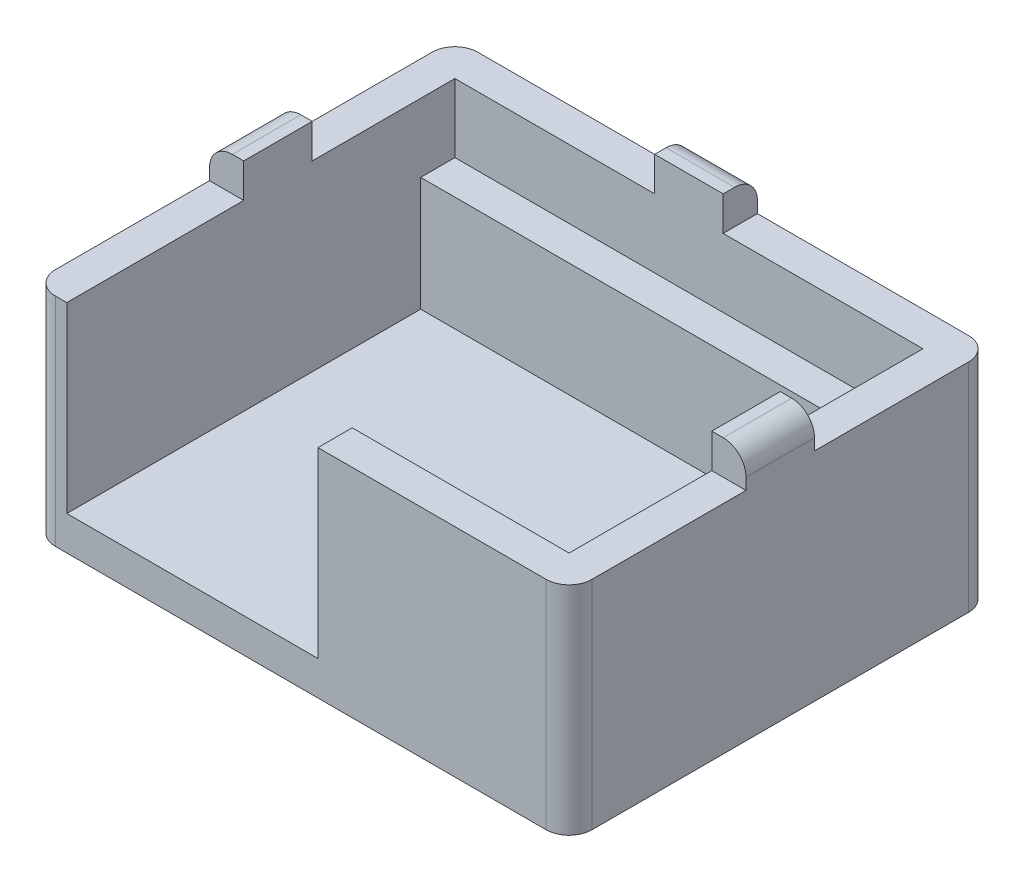
ISO-10303-21;
HEADER;
FILE_DESCRIPTION(('STEP AP214'),'2;1');
FILE_NAME('part.step','',(''),(''),'','','');
FILE_SCHEMA(('AUTOMOTIVE_DESIGN { 1 0 10303 214 1 1 1 1 }'));
ENDSEC;
DATA;
#1=APPLICATION_CONTEXT('core data for automotive mechanical design processes');
#2=APPLICATION_PROTOCOL_DEFINITION('international standard','automotive_design',2000,#1);
#3=PRODUCT_CONTEXT('',#1,'mechanical');
#4=PRODUCT('Part','Part','',(#3));
#5=PRODUCT_RELATED_PRODUCT_CATEGORY('part','',(#4));
#6=PRODUCT_DEFINITION_FORMATION('','',#4);
#7=PRODUCT_DEFINITION_CONTEXT('part definition',#1,'design');
#8=PRODUCT_DEFINITION('design','',#6,#7);
#9=PRODUCT_DEFINITION_SHAPE('','',#8);
#10=(LENGTH_UNIT() NAMED_UNIT(*) SI_UNIT(.MILLI.,.METRE.));
#11=(NAMED_UNIT(*) PLANE_ANGLE_UNIT() SI_UNIT($,.RADIAN.));
#12=(NAMED_UNIT(*) SI_UNIT($,.STERADIAN.) SOLID_ANGLE_UNIT());
#13=UNCERTAINTY_MEASURE_WITH_UNIT(LENGTH_MEASURE(1.E-05),#10,'distance_accuracy_value','');
#14=(GEOMETRIC_REPRESENTATION_CONTEXT(3) GLOBAL_UNCERTAINTY_ASSIGNED_CONTEXT((#13)) GLOBAL_UNIT_ASSIGNED_CONTEXT((#10,
#11,#12)) REPRESENTATION_CONTEXT('',''));
#15=CARTESIAN_POINT('',(0.,0.,0.));
#16=DIRECTION('',(0.,0.,1.));
#17=DIRECTION('',(1.,0.,0.));
#18=AXIS2_PLACEMENT_3D('',#15,#16,#17);
#19=CARTESIAN_POINT('',(-13.8612099644128,8.,-7.69661921708185));
#20=DIRECTION('',(1.,0.,0.));
#21=DIRECTION('',(0.,0.,-1.));
#22=AXIS2_PLACEMENT_3D('',#19,#20,#21);
#23=PLANE('',#22);
#24=DIRECTION('',(0.,0.,1.));
#25=VECTOR('',#24,1.);
#26=CARTESIAN_POINT('',(-13.8612099644128,0.,-7.69661921708185));
#27=LINE('',#26,#25);
#28=CARTESIAN_POINT('',(-13.8612099644128,0.,-6.19661921708185));
#29=VERTEX_POINT('',#28);
#30=CARTESIAN_POINT('',(-13.8612099644128,0.,9.30338078291815));
#31=VERTEX_POINT('',#30);
#32=EDGE_CURVE('E244',#29,#31,#27,.T.);
#33=ORIENTED_EDGE('',*,*,#32,.F.);
#34=DIRECTION('',(0.,-1.,0.));
#35=VECTOR('',#34,1.);
#36=CARTESIAN_POINT('',(-13.8612099644128,5.,-6.19661921708185));
#37=LINE('',#36,#35);
#38=CARTESIAN_POINT('',(-13.8612099644128,5.,-6.19661921708185));
#39=VERTEX_POINT('',#38);
#40=EDGE_CURVE('E250',#39,#29,#37,.T.);
#41=ORIENTED_EDGE('',*,*,#40,.F.);
#42=DIRECTION('',(0.,0.,1.));
#43=VECTOR('',#42,1.);
#44=CARTESIAN_POINT('',(-13.8612099644128,5.,-7.69661921708185));
#45=LINE('',#44,#43);
#46=CARTESIAN_POINT('',(-13.8612099644128,5.,-7.69661921708185));
#47=VERTEX_POINT('',#46);
#48=EDGE_CURVE('E269',#47,#39,#45,.T.);
#49=ORIENTED_EDGE('',*,*,#48,.F.);
#50=DIRECTION('',(0.,-1.,0.));
#51=VECTOR('',#50,1.);
#52=CARTESIAN_POINT('',(-13.8612099644128,8.,-7.69661921708185));
#53=LINE('',#52,#51);
#54=CARTESIAN_POINT('',(-13.8612099644128,8.,-7.69661921708185));
#55=VERTEX_POINT('',#54);
#56=EDGE_CURVE('E367',#55,#47,#53,.T.);
#57=ORIENTED_EDGE('',*,*,#56,.F.);
#58=DIRECTION('',(0.,0.,1.));
#59=VECTOR('',#58,1.);
#60=CARTESIAN_POINT('',(-13.8612099644128,8.,-7.69661921708185));
#61=LINE('',#60,#59);
#62=CARTESIAN_POINT('',(-13.8612099644128,8.,-1.44661921708185));
#63=VERTEX_POINT('',#62);
#64=EDGE_CURVE('E353',#55,#63,#61,.T.);
#65=ORIENTED_EDGE('',*,*,#64,.T.);
#66=DIRECTION('',(0.,-1.,0.));
#67=VECTOR('',#66,1.);
#68=CARTESIAN_POINT('',(-13.8612099644128,9.5,-1.44661921708185));
#69=LINE('',#68,#67);
#70=CARTESIAN_POINT('',(-13.8612099644128,9.5,-1.44661921708185));
#71=VERTEX_POINT('',#70);
#72=EDGE_CURVE('E323',#71,#63,#69,.T.);
#73=ORIENTED_EDGE('',*,*,#72,.F.);
#74=DIRECTION('',(0.,0.,-1.));
#75=VECTOR('',#74,1.);
#76=CARTESIAN_POINT('',(-13.8612099644128,9.5,-1.44661921708185));
#77=LINE('',#76,#75);
#78=CARTESIAN_POINT('',(-13.8612099644128,9.5,1.55338078291815));
#79=VERTEX_POINT('',#78);
#80=EDGE_CURVE('E307',#79,#71,#77,.T.);
#81=ORIENTED_EDGE('',*,*,#80,.F.);
#82=DIRECTION('',(0.,-1.,0.));
#83=VECTOR('',#82,1.);
#84=CARTESIAN_POINT('',(-13.8612099644128,9.5,1.55338078291815));
#85=LINE('',#84,#83);
#86=CARTESIAN_POINT('',(-13.8612099644128,8.,1.55338078291815));
#87=VERTEX_POINT('',#86);
#88=EDGE_CURVE('E315',#79,#87,#85,.T.);
#89=ORIENTED_EDGE('',*,*,#88,.T.);
#90=CARTESIAN_POINT('',(-13.8612099644128,8.,9.30338078291815));
#91=VERTEX_POINT('',#90);
#92=EDGE_CURVE('E357',#87,#91,#61,.T.);
#93=ORIENTED_EDGE('',*,*,#92,.T.);
#94=DIRECTION('',(0.,1.,0.));
#95=VECTOR('',#94,1.);
#96=CARTESIAN_POINT('',(-13.8612099644128,0.,9.30338078291815));
#97=LINE('',#96,#95);
#98=EDGE_CURVE('E249',#31,#91,#97,.T.);
#99=ORIENTED_EDGE('',*,*,#98,.F.);
#100=EDGE_LOOP('',(#33,#41,#49,#57,#65,#73,#81,#89,#93,#99));
#101=FACE_BOUND('',#100,.T.);
#102=ADVANCED_FACE('F33',(#101),#23,.T.);
#103=CARTESIAN_POINT('',(6.63879003558719,8.,-7.69661921708185));
#104=DIRECTION('',(-1.,0.,0.));
#105=DIRECTION('',(0.,0.,1.));
#106=AXIS2_PLACEMENT_3D('',#103,#104,#105);
#107=PLANE('',#106);
#108=DIRECTION('',(0.,0.,-1.));
#109=VECTOR('',#108,1.);
#110=CARTESIAN_POINT('',(6.63879003558719,5.,-7.69661921708185));
#111=LINE('',#110,#109);
#112=CARTESIAN_POINT('',(6.63879003558719,5.,-6.19661921708185));
#113=VERTEX_POINT('',#112);
#114=CARTESIAN_POINT('',(6.63879003558719,5.,-7.69661921708185));
#115=VERTEX_POINT('',#114);
#116=EDGE_CURVE('E274',#113,#115,#111,.T.);
#117=ORIENTED_EDGE('',*,*,#116,.F.);
#118=DIRECTION('',(0.,-1.,0.));
#119=VECTOR('',#118,1.);
#120=CARTESIAN_POINT('',(6.63879003558719,5.,-6.19661921708185));
#121=LINE('',#120,#119);
#122=CARTESIAN_POINT('',(6.63879003558719,0.,-6.19661921708185));
#123=VERTEX_POINT('',#122);
#124=EDGE_CURVE('E278',#113,#123,#121,.T.);
#125=ORIENTED_EDGE('',*,*,#124,.T.);
#126=DIRECTION('',(0.,0.,-1.));
#127=VECTOR('',#126,1.);
#128=CARTESIAN_POINT('',(6.63879003558719,0.,-7.69661921708185));
#129=LINE('',#128,#127);
#130=CARTESIAN_POINT('',(6.63879003558719,0.,7.80338078291815));
#131=VERTEX_POINT('',#130);
#132=EDGE_CURVE('E371',#131,#123,#129,.T.);
#133=ORIENTED_EDGE('',*,*,#132,.F.);
#134=DIRECTION('',(0.,-1.,0.));
#135=VECTOR('',#134,1.);
#136=CARTESIAN_POINT('',(6.63879003558719,8.,7.80338078291815));
#137=LINE('',#136,#135);
#138=CARTESIAN_POINT('',(6.63879003558719,8.,7.80338078291815));
#139=VERTEX_POINT('',#138);
#140=EDGE_CURVE('E379',#139,#131,#137,.T.);
#141=ORIENTED_EDGE('',*,*,#140,.F.);
#142=DIRECTION('',(0.,0.,-1.));
#143=VECTOR('',#142,1.);
#144=CARTESIAN_POINT('',(6.63879003558719,8.,-7.69661921708185));
#145=LINE('',#144,#143);
#146=CARTESIAN_POINT('',(6.63879003558719,8.,1.55338078291815));
#147=VERTEX_POINT('',#146);
#148=EDGE_CURVE('E360',#139,#147,#145,.T.);
#149=ORIENTED_EDGE('',*,*,#148,.T.);
#150=DIRECTION('',(0.,-1.,0.));
#151=VECTOR('',#150,1.);
#152=CARTESIAN_POINT('',(6.63879003558719,9.5,1.55338078291815));
#153=LINE('',#152,#151);
#154=CARTESIAN_POINT('',(6.63879003558719,9.5,1.55338078291815));
#155=VERTEX_POINT('',#154);
#156=EDGE_CURVE('E294',#155,#147,#153,.T.);
#157=ORIENTED_EDGE('',*,*,#156,.F.);
#158=DIRECTION('',(0.,0.,1.));
#159=VECTOR('',#158,1.);
#160=CARTESIAN_POINT('',(6.63879003558719,9.5,-1.44661921708185));
#161=LINE('',#160,#159);
#162=CARTESIAN_POINT('',(6.63879003558719,9.5,-1.44661921708185));
#163=VERTEX_POINT('',#162);
#164=EDGE_CURVE('E286',#163,#155,#161,.T.);
#165=ORIENTED_EDGE('',*,*,#164,.F.);
#166=DIRECTION('',(0.,-1.,0.));
#167=VECTOR('',#166,1.);
#168=CARTESIAN_POINT('',(6.63879003558719,9.5,-1.44661921708185));
#169=LINE('',#168,#167);
#170=CARTESIAN_POINT('',(6.63879003558719,8.,-1.44661921708185));
#171=VERTEX_POINT('',#170);
#172=EDGE_CURVE('E296',#163,#171,#169,.T.);
#173=ORIENTED_EDGE('',*,*,#172,.T.);
#174=CARTESIAN_POINT('',(6.63879003558719,8.,-7.69661921708185));
#175=VERTEX_POINT('',#174);
#176=EDGE_CURVE('E359',#171,#175,#145,.T.);
#177=ORIENTED_EDGE('',*,*,#176,.T.);
#178=DIRECTION('',(0.,-1.,0.));
#179=VECTOR('',#178,1.);
#180=CARTESIAN_POINT('',(6.63879003558719,8.,-7.69661921708185));
#181=LINE('',#180,#179);
#182=EDGE_CURVE('E376',#175,#115,#181,.T.);
#183=ORIENTED_EDGE('',*,*,#182,.T.);
#184=EDGE_LOOP('',(#117,#125,#133,#141,#149,#157,#165,#173,#177,#183));
#185=FACE_BOUND('',#184,.T.);
#186=ADVANCED_FACE('F509',(#185),#107,.T.);
#187=CARTESIAN_POINT('',(0.,0.,0.));
#188=DIRECTION('',(0.,1.,0.));
#189=DIRECTION('',(0.,0.,1.));
#190=AXIS2_PLACEMENT_3D('',#187,#188,#189);
#191=PLANE('',#190);
#192=DIRECTION('',(0.,0.,-1.));
#193=VECTOR('',#192,1.);
#194=CARTESIAN_POINT('',(-2.86120996441281,0.,7.80338078291815));
#195=LINE('',#194,#193);
#196=CARTESIAN_POINT('',(-2.86120996441281,0.,9.30338078291815));
#197=VERTEX_POINT('',#196);
#198=CARTESIAN_POINT('',(-2.86120996441281,0.,7.80338078291815));
#199=VERTEX_POINT('',#198);
#200=EDGE_CURVE('E240',#197,#199,#195,.T.);
#201=ORIENTED_EDGE('',*,*,#200,.T.);
#202=DIRECTION('',(1.,0.,0.));
#203=VECTOR('',#202,1.);
#204=CARTESIAN_POINT('',(-13.8612099644128,0.,7.80338078291815));
#205=LINE('',#204,#203);
#206=EDGE_CURVE('E369',#199,#131,#205,.T.);
#207=ORIENTED_EDGE('',*,*,#206,.T.);
#208=ORIENTED_EDGE('',*,*,#132,.T.);
#209=DIRECTION('',(1.,0.,0.));
#210=VECTOR('',#209,1.);
#211=CARTESIAN_POINT('',(-13.8612099644128,0.,-6.19661921708185));
#212=LINE('',#211,#210);
#213=EDGE_CURVE('E265',#29,#123,#212,.T.);
#214=ORIENTED_EDGE('',*,*,#213,.F.);
#215=ORIENTED_EDGE('',*,*,#32,.T.);
#216=DIRECTION('',(1.,0.,0.));
#217=VECTOR('',#216,1.);
#218=CARTESIAN_POINT('',(-13.8612099644128,0.,9.30338078291815));
#219=LINE('',#218,#217);
#220=EDGE_CURVE('E237',#31,#197,#219,.T.);
#221=ORIENTED_EDGE('',*,*,#220,.T.);
#222=EDGE_LOOP('',(#201,#207,#208,#214,#215,#221));
#223=FACE_BOUND('',#222,.T.);
#224=ADVANCED_FACE('F239',(#223),#191,.T.);
#225=CARTESIAN_POINT('',(0.,8.,0.));
#226=DIRECTION('',(0.,1.,0.));
#227=DIRECTION('',(0.,0.,1.));
#228=AXIS2_PLACEMENT_3D('',#225,#226,#227);
#229=PLANE('',#228);
#230=DIRECTION('',(0.,0.,1.));
#231=VECTOR('',#230,1.);
#232=CARTESIAN_POINT('',(-15.3612099644128,8.,-7.69661921708185));
#233=LINE('',#232,#231);
#234=CARTESIAN_POINT('',(-15.3612099644128,8.,1.55338078291815));
#235=VERTEX_POINT('',#234);
#236=CARTESIAN_POINT('',(-15.3612099644128,8.,8.30338078291815));
#237=VERTEX_POINT('',#236);
#238=EDGE_CURVE('E393',#235,#237,#233,.T.);
#239=ORIENTED_EDGE('',*,*,#238,.T.);
#240=CARTESIAN_POINT('',(-14.3612099644128,8.,8.30338078291815));
#241=DIRECTION('',(0.,1.,0.));
#242=DIRECTION('',(0.,0.,1.));
#243=AXIS2_PLACEMENT_3D('',#240,#241,#242);
#244=CIRCLE('',#243,1.);
#245=CARTESIAN_POINT('',(-14.3612099644128,8.,9.30338078291815));
#246=VERTEX_POINT('',#245);
#247=EDGE_CURVE('E41',#237,#246,#244,.T.);
#248=ORIENTED_EDGE('',*,*,#247,.T.);
#249=DIRECTION('',(1.,0.,0.));
#250=VECTOR('',#249,1.);
#251=CARTESIAN_POINT('',(-13.8612099644128,8.,9.30338078291815));
#252=LINE('',#251,#250);
#253=EDGE_CURVE('E396',#246,#91,#252,.T.);
#254=ORIENTED_EDGE('',*,*,#253,.T.);
#255=ORIENTED_EDGE('',*,*,#92,.F.);
#256=DIRECTION('',(-1.,0.,0.));
#257=VECTOR('',#256,1.);
#258=CARTESIAN_POINT('',(0.,8.,1.55338078291816));
#259=LINE('',#258,#257);
#260=EDGE_CURVE('E325',#87,#235,#259,.T.);
#261=ORIENTED_EDGE('',*,*,#260,.T.);
#262=EDGE_LOOP('',(#239,#248,#254,#255,#261));
#263=FACE_BOUND('',#262,.T.);
#264=ADVANCED_FACE('F464',(#263),#229,.T.);
#265=DIRECTION('',(0.,0.,-1.));
#266=VECTOR('',#265,1.);
#267=CARTESIAN_POINT('',(8.13879003558719,8.,-7.69661921708185));
#268=LINE('',#267,#266);
#269=CARTESIAN_POINT('',(8.13879003558719,8.,-1.44661921708185));
#270=VERTEX_POINT('',#269);
#271=CARTESIAN_POINT('',(8.13879003558719,8.,-8.19661921708185));
#272=VERTEX_POINT('',#271);
#273=EDGE_CURVE('E398',#270,#272,#268,.T.);
#274=ORIENTED_EDGE('',*,*,#273,.T.);
#275=CARTESIAN_POINT('',(7.13879003558719,8.,-8.19661921708185));
#276=DIRECTION('',(0.,1.,0.));
#277=DIRECTION('',(0.,0.,1.));
#278=AXIS2_PLACEMENT_3D('',#275,#276,#277);
#279=CIRCLE('',#278,1.);
#280=CARTESIAN_POINT('',(7.13879003558719,8.,-9.19661921708185));
#281=VERTEX_POINT('',#280);
#282=EDGE_CURVE('E449',#272,#281,#279,.T.);
#283=ORIENTED_EDGE('',*,*,#282,.T.);
#284=DIRECTION('',(-1.,0.,0.));
#285=VECTOR('',#284,1.);
#286=CARTESIAN_POINT('',(-13.8612099644128,8.,-9.19661921708185));
#287=LINE('',#286,#285);
#288=CARTESIAN_POINT('',(-2.11120996441281,8.,-9.19661921708185));
#289=VERTEX_POINT('',#288);
#290=EDGE_CURVE('E402',#281,#289,#287,.T.);
#291=ORIENTED_EDGE('',*,*,#290,.T.);
#292=DIRECTION('',(0.,0.,1.));
#293=VECTOR('',#292,1.);
#294=CARTESIAN_POINT('',(-2.11120996441282,8.,0.));
#295=LINE('',#294,#293);
#296=CARTESIAN_POINT('',(-2.11120996441281,8.,-7.69661921708185));
#297=VERTEX_POINT('',#296);
#298=EDGE_CURVE('E350',#289,#297,#295,.T.);
#299=ORIENTED_EDGE('',*,*,#298,.T.);
#300=DIRECTION('',(-1.,0.,0.));
#301=VECTOR('',#300,1.);
#302=CARTESIAN_POINT('',(-13.8612099644128,8.,-7.69661921708185));
#303=LINE('',#302,#301);
#304=EDGE_CURVE('E364',#175,#297,#303,.T.);
#305=ORIENTED_EDGE('',*,*,#304,.F.);
#306=ORIENTED_EDGE('',*,*,#176,.F.);
#307=DIRECTION('',(1.,0.,0.));
#308=VECTOR('',#307,1.);
#309=CARTESIAN_POINT('',(0.,8.,-1.44661921708185));
#310=LINE('',#309,#308);
#311=EDGE_CURVE('E304',#171,#270,#310,.T.);
#312=ORIENTED_EDGE('',*,*,#311,.T.);
#313=EDGE_LOOP('',(#274,#283,#291,#299,#305,#306,#312));
#314=FACE_BOUND('',#313,.T.);
#315=ADVANCED_FACE('F563',(#314),#229,.T.);
#316=DIRECTION('',(0.,0.,-1.));
#317=VECTOR('',#316,1.);
#318=CARTESIAN_POINT('',(-2.86120996441281,8.,7.80338078291815));
#319=LINE('',#318,#317);
#320=CARTESIAN_POINT('',(-2.86120996441281,8.,9.30338078291815));
#321=VERTEX_POINT('',#320);
#322=CARTESIAN_POINT('',(-2.86120996441281,8.,7.80338078291815));
#323=VERTEX_POINT('',#322);
#324=EDGE_CURVE('E258',#321,#323,#319,.T.);
#325=ORIENTED_EDGE('',*,*,#324,.F.);
#326=CARTESIAN_POINT('',(7.13879003558719,8.,9.30338078291815));
#327=VERTEX_POINT('',#326);
#328=EDGE_CURVE('E263',#321,#327,#252,.T.);
#329=ORIENTED_EDGE('',*,*,#328,.T.);
#330=CARTESIAN_POINT('',(7.13879003558719,8.,8.30338078291815));
#331=DIRECTION('',(0.,1.,0.));
#332=DIRECTION('',(0.,0.,1.));
#333=AXIS2_PLACEMENT_3D('',#330,#331,#332);
#334=CIRCLE('',#333,1.);
#335=CARTESIAN_POINT('',(8.13879003558719,8.,8.30338078291815));
#336=VERTEX_POINT('',#335);
#337=EDGE_CURVE('E456',#327,#336,#334,.T.);
#338=ORIENTED_EDGE('',*,*,#337,.T.);
#339=CARTESIAN_POINT('',(8.13879003558719,8.,1.55338078291815));
#340=VERTEX_POINT('',#339);
#341=EDGE_CURVE('E399',#336,#340,#268,.T.);
#342=ORIENTED_EDGE('',*,*,#341,.T.);
#343=DIRECTION('',(-1.,0.,0.));
#344=VECTOR('',#343,1.);
#345=CARTESIAN_POINT('',(0.,8.,1.55338078291815));
#346=LINE('',#345,#344);
#347=EDGE_CURVE('E301',#340,#147,#346,.T.);
#348=ORIENTED_EDGE('',*,*,#347,.T.);
#349=ORIENTED_EDGE('',*,*,#148,.F.);
#350=DIRECTION('',(1.,0.,0.));
#351=VECTOR('',#350,1.);
#352=CARTESIAN_POINT('',(-13.8612099644128,8.,7.80338078291815));
#353=LINE('',#352,#351);
#354=EDGE_CURVE('E356',#323,#139,#353,.T.);
#355=ORIENTED_EDGE('',*,*,#354,.F.);
#356=EDGE_LOOP('',(#325,#329,#338,#342,#348,#349,#355));
#357=FACE_BOUND('',#356,.T.);
#358=ADVANCED_FACE('F500',(#357),#229,.T.);
#359=CARTESIAN_POINT('',(-5.11120996441281,8.,-9.19661921708185));
#360=VERTEX_POINT('',#359);
#361=CARTESIAN_POINT('',(-14.3612099644128,8.,-9.19661921708185));
#362=VERTEX_POINT('',#361);
#363=EDGE_CURVE('E401',#360,#362,#287,.T.);
#364=ORIENTED_EDGE('',*,*,#363,.T.);
#365=CARTESIAN_POINT('',(-14.3612099644128,8.,-8.19661921708185));
#366=DIRECTION('',(0.,1.,0.));
#367=DIRECTION('',(0.,0.,1.));
#368=AXIS2_PLACEMENT_3D('',#365,#366,#367);
#369=CIRCLE('',#368,1.);
#370=CARTESIAN_POINT('',(-15.3612099644128,8.,-8.19661921708185));
#371=VERTEX_POINT('',#370);
#372=EDGE_CURVE('E11',#362,#371,#369,.T.);
#373=ORIENTED_EDGE('',*,*,#372,.T.);
#374=CARTESIAN_POINT('',(-15.3612099644128,8.,-1.44661921708185));
#375=VERTEX_POINT('',#374);
#376=EDGE_CURVE('E394',#371,#375,#233,.T.);
#377=ORIENTED_EDGE('',*,*,#376,.T.);
#378=DIRECTION('',(1.,0.,0.));
#379=VECTOR('',#378,1.);
#380=CARTESIAN_POINT('',(0.,8.,-1.44661921708185));
#381=LINE('',#380,#379);
#382=EDGE_CURVE('E328',#375,#63,#381,.T.);
#383=ORIENTED_EDGE('',*,*,#382,.T.);
#384=ORIENTED_EDGE('',*,*,#64,.F.);
#385=CARTESIAN_POINT('',(-5.11120996441281,8.,-7.69661921708185));
#386=VERTEX_POINT('',#385);
#387=EDGE_CURVE('E363',#386,#55,#303,.T.);
#388=ORIENTED_EDGE('',*,*,#387,.F.);
#389=DIRECTION('',(0.,0.,-1.));
#390=VECTOR('',#389,1.);
#391=CARTESIAN_POINT('',(-5.11120996441281,8.,0.));
#392=LINE('',#391,#390);
#393=EDGE_CURVE('E347',#386,#360,#392,.T.);
#394=ORIENTED_EDGE('',*,*,#393,.T.);
#395=EDGE_LOOP('',(#364,#373,#377,#383,#384,#388,#394));
#396=FACE_BOUND('',#395,.T.);
#397=ADVANCED_FACE('F535',(#396),#229,.T.);
#398=CARTESIAN_POINT('',(-15.3612099644128,8.,-7.69661921708185));
#399=DIRECTION('',(1.,0.,0.));
#400=DIRECTION('',(0.,0.,-1.));
#401=AXIS2_PLACEMENT_3D('',#398,#399,#400);
#402=PLANE('',#401);
#403=DIRECTION('',(0.,0.,1.));
#404=VECTOR('',#403,1.);
#405=CARTESIAN_POINT('',(-15.3612099644128,-1.5,-7.69661921708185));
#406=LINE('',#405,#404);
#407=CARTESIAN_POINT('',(-15.3612099644128,-1.5,-8.19661921708185));
#408=VERTEX_POINT('',#407);
#409=CARTESIAN_POINT('',(-15.3612099644128,-1.5,8.30338078291815));
#410=VERTEX_POINT('',#409);
#411=EDGE_CURVE('E382',#408,#410,#406,.T.);
#412=ORIENTED_EDGE('',*,*,#411,.T.);
#413=DIRECTION('',(0.,-1.,0.));
#414=VECTOR('',#413,1.);
#415=CARTESIAN_POINT('',(-15.3612099644128,8.,8.30338078291815));
#416=LINE('',#415,#414);
#417=EDGE_CURVE('E48',#410,#237,#416,.F.);
#418=ORIENTED_EDGE('',*,*,#417,.T.);
#419=ORIENTED_EDGE('',*,*,#238,.F.);
#420=DIRECTION('',(0.,-1.,0.));
#421=VECTOR('',#420,1.);
#422=CARTESIAN_POINT('',(-15.3612099644128,9.5,1.55338078291815));
#423=LINE('',#422,#421);
#424=CARTESIAN_POINT('',(-15.3612099644128,8.5,1.55338078291815));
#425=VERTEX_POINT('',#424);
#426=EDGE_CURVE('E318',#425,#235,#423,.T.);
#427=ORIENTED_EDGE('',*,*,#426,.F.);
#428=DIRECTION('',(0.,0.,1.));
#429=VECTOR('',#428,1.);
#430=CARTESIAN_POINT('',(-15.3612099644128,8.5,-1.44661921708185));
#431=LINE('',#430,#429);
#432=CARTESIAN_POINT('',(-15.3612099644128,8.5,-1.44661921708185));
#433=VERTEX_POINT('',#432);
#434=EDGE_CURVE('E409',#425,#433,#431,.F.);
#435=ORIENTED_EDGE('',*,*,#434,.T.);
#436=DIRECTION('',(0.,-1.,0.));
#437=VECTOR('',#436,1.);
#438=CARTESIAN_POINT('',(-15.3612099644128,9.5,-1.44661921708185));
#439=LINE('',#438,#437);
#440=EDGE_CURVE('E320',#433,#375,#439,.T.);
#441=ORIENTED_EDGE('',*,*,#440,.T.);
#442=ORIENTED_EDGE('',*,*,#376,.F.);
#443=DIRECTION('',(0.,-1.,0.));
#444=VECTOR('',#443,1.);
#445=CARTESIAN_POINT('',(-15.3612099644128,8.,-8.19661921708185));
#446=LINE('',#445,#444);
#447=EDGE_CURVE('E458',#371,#408,#446,.T.);
#448=ORIENTED_EDGE('',*,*,#447,.T.);
#449=EDGE_LOOP('',(#412,#418,#419,#427,#435,#441,#442,#448));
#450=FACE_BOUND('',#449,.T.);
#451=ADVANCED_FACE('F475',(#450),#402,.F.);
#452=CARTESIAN_POINT('',(-13.8612099644128,8.,9.30338078291815));
#453=DIRECTION('',(0.,0.,-1.));
#454=DIRECTION('',(-1.,0.,0.));
#455=AXIS2_PLACEMENT_3D('',#452,#453,#454);
#456=PLANE('',#455);
#457=ORIENTED_EDGE('',*,*,#328,.F.);
#458=DIRECTION('',(0.,1.,0.));
#459=VECTOR('',#458,1.);
#460=CARTESIAN_POINT('',(-2.86120996441281,0.,9.30338078291815));
#461=LINE('',#460,#459);
#462=EDGE_CURVE('E254',#197,#321,#461,.T.);
#463=ORIENTED_EDGE('',*,*,#462,.F.);
#464=ORIENTED_EDGE('',*,*,#220,.F.);
#465=ORIENTED_EDGE('',*,*,#98,.T.);
#466=ORIENTED_EDGE('',*,*,#253,.F.);
#467=DIRECTION('',(0.,-1.,0.));
#468=VECTOR('',#467,1.);
#469=CARTESIAN_POINT('',(-14.3612099644128,8.,9.30338078291815));
#470=LINE('',#469,#468);
#471=CARTESIAN_POINT('',(-14.3612099644128,-1.5,9.30338078291815));
#472=VERTEX_POINT('',#471);
#473=EDGE_CURVE('E451',#246,#472,#470,.T.);
#474=ORIENTED_EDGE('',*,*,#473,.T.);
#475=DIRECTION('',(1.,0.,0.));
#476=VECTOR('',#475,1.);
#477=CARTESIAN_POINT('',(-13.8612099644128,-1.5,9.30338078291815));
#478=LINE('',#477,#476);
#479=CARTESIAN_POINT('',(7.13879003558719,-1.5,9.30338078291815));
#480=VERTEX_POINT('',#479);
#481=EDGE_CURVE('E384',#472,#480,#478,.T.);
#482=ORIENTED_EDGE('',*,*,#481,.T.);
#483=DIRECTION('',(0.,-1.,0.));
#484=VECTOR('',#483,1.);
#485=CARTESIAN_POINT('',(7.13879003558719,8.,9.30338078291815));
#486=LINE('',#485,#484);
#487=EDGE_CURVE('E454',#480,#327,#486,.F.);
#488=ORIENTED_EDGE('',*,*,#487,.T.);
#489=EDGE_LOOP('',(#457,#463,#464,#465,#466,#474,#482,#488));
#490=FACE_BOUND('',#489,.T.);
#491=ADVANCED_FACE('F261',(#490),#456,.F.);
#492=CARTESIAN_POINT('',(8.13879003558719,8.,-7.69661921708185));
#493=DIRECTION('',(-1.,0.,0.));
#494=DIRECTION('',(0.,0.,1.));
#495=AXIS2_PLACEMENT_3D('',#492,#493,#494);
#496=PLANE('',#495);
#497=DIRECTION('',(0.,0.,-1.));
#498=VECTOR('',#497,1.);
#499=CARTESIAN_POINT('',(8.13879003558719,-1.5,-7.69661921708185));
#500=LINE('',#499,#498);
#501=CARTESIAN_POINT('',(8.13879003558719,-1.5,8.30338078291815));
#502=VERTEX_POINT('',#501);
#503=CARTESIAN_POINT('',(8.13879003558719,-1.5,-8.19661921708185));
#504=VERTEX_POINT('',#503);
#505=EDGE_CURVE('E387',#502,#504,#500,.T.);
#506=ORIENTED_EDGE('',*,*,#505,.T.);
#507=DIRECTION('',(0.,-1.,0.));
#508=VECTOR('',#507,1.);
#509=CARTESIAN_POINT('',(8.13879003558719,8.,-8.19661921708185));
#510=LINE('',#509,#508);
#511=EDGE_CURVE('E447',#504,#272,#510,.F.);
#512=ORIENTED_EDGE('',*,*,#511,.T.);
#513=ORIENTED_EDGE('',*,*,#273,.F.);
#514=DIRECTION('',(0.,-1.,0.));
#515=VECTOR('',#514,1.);
#516=CARTESIAN_POINT('',(8.13879003558719,9.5,-1.44661921708185));
#517=LINE('',#516,#515);
#518=CARTESIAN_POINT('',(8.13879003558719,8.5,-1.44661921708185));
#519=VERTEX_POINT('',#518);
#520=EDGE_CURVE('E299',#519,#270,#517,.T.);
#521=ORIENTED_EDGE('',*,*,#520,.F.);
#522=DIRECTION('',(0.,0.,-1.));
#523=VECTOR('',#522,1.);
#524=CARTESIAN_POINT('',(8.13879003558719,8.5,-7.69661921708185));
#525=LINE('',#524,#523);
#526=CARTESIAN_POINT('',(8.13879003558719,8.5,1.55338078291815));
#527=VERTEX_POINT('',#526);
#528=EDGE_CURVE('E427',#519,#527,#525,.F.);
#529=ORIENTED_EDGE('',*,*,#528,.T.);
#530=DIRECTION('',(0.,-1.,0.));
#531=VECTOR('',#530,1.);
#532=CARTESIAN_POINT('',(8.13879003558719,9.5,1.55338078291815));
#533=LINE('',#532,#531);
#534=EDGE_CURVE('E291',#527,#340,#533,.T.);
#535=ORIENTED_EDGE('',*,*,#534,.T.);
#536=ORIENTED_EDGE('',*,*,#341,.F.);
#537=DIRECTION('',(0.,-1.,0.));
#538=VECTOR('',#537,1.);
#539=CARTESIAN_POINT('',(8.13879003558719,8.,8.30338078291815));
#540=LINE('',#539,#538);
#541=EDGE_CURVE('E444',#336,#502,#540,.T.);
#542=ORIENTED_EDGE('',*,*,#541,.T.);
#543=EDGE_LOOP('',(#506,#512,#513,#521,#529,#535,#536,#542));
#544=FACE_BOUND('',#543,.T.);
#545=ADVANCED_FACE('F490',(#544),#496,.F.);
#546=CARTESIAN_POINT('',(-13.8612099644128,8.,-9.19661921708185));
#547=DIRECTION('',(0.,0.,1.));
#548=DIRECTION('',(1.,0.,0.));
#549=AXIS2_PLACEMENT_3D('',#546,#547,#548);
#550=PLANE('',#549);
#551=ORIENTED_EDGE('',*,*,#290,.F.);
#552=DIRECTION('',(0.,-1.,0.));
#553=VECTOR('',#552,1.);
#554=CARTESIAN_POINT('',(7.13879003558719,8.,-9.19661921708185));
#555=LINE('',#554,#553);
#556=CARTESIAN_POINT('',(7.13879003558719,-1.5,-9.19661921708185));
#557=VERTEX_POINT('',#556);
#558=EDGE_CURVE('E433',#281,#557,#555,.T.);
#559=ORIENTED_EDGE('',*,*,#558,.T.);
#560=DIRECTION('',(-1.,0.,0.));
#561=VECTOR('',#560,1.);
#562=CARTESIAN_POINT('',(-13.8612099644128,-1.5,-9.19661921708185));
#563=LINE('',#562,#561);
#564=CARTESIAN_POINT('',(-14.3612099644128,-1.5,-9.19661921708185));
#565=VERTEX_POINT('',#564);
#566=EDGE_CURVE('E390',#557,#565,#563,.T.);
#567=ORIENTED_EDGE('',*,*,#566,.T.);
#568=DIRECTION('',(0.,-1.,0.));
#569=VECTOR('',#568,1.);
#570=CARTESIAN_POINT('',(-14.3612099644128,8.,-9.19661921708185));
#571=LINE('',#570,#569);
#572=EDGE_CURVE('E431',#565,#362,#571,.F.);
#573=ORIENTED_EDGE('',*,*,#572,.T.);
#574=ORIENTED_EDGE('',*,*,#363,.F.);
#575=DIRECTION('',(0.,-1.,0.));
#576=VECTOR('',#575,1.);
#577=CARTESIAN_POINT('',(-5.11120996441281,9.5,-9.19661921708185));
#578=LINE('',#577,#576);
#579=CARTESIAN_POINT('',(-5.11120996441281,8.5,-9.19661921708185));
#580=VERTEX_POINT('',#579);
#581=EDGE_CURVE('E342',#580,#360,#578,.T.);
#582=ORIENTED_EDGE('',*,*,#581,.F.);
#583=DIRECTION('',(-1.,0.,0.));
#584=VECTOR('',#583,1.);
#585=CARTESIAN_POINT('',(-2.11120996441281,8.5,-9.19661921708185));
#586=LINE('',#585,#584);
#587=CARTESIAN_POINT('',(-2.11120996441281,8.5,-9.19661921708185));
#588=VERTEX_POINT('',#587);
#589=EDGE_CURVE('E418',#580,#588,#586,.F.);
#590=ORIENTED_EDGE('',*,*,#589,.T.);
#591=DIRECTION('',(0.,-1.,0.));
#592=VECTOR('',#591,1.);
#593=CARTESIAN_POINT('',(-2.11120996441281,9.5,-9.19661921708185));
#594=LINE('',#593,#592);
#595=EDGE_CURVE('E344',#588,#289,#594,.T.);
#596=ORIENTED_EDGE('',*,*,#595,.T.);
#597=EDGE_LOOP('',(#551,#559,#567,#573,#574,#582,#590,#596));
#598=FACE_BOUND('',#597,.T.);
#599=ADVANCED_FACE('F481',(#598),#550,.F.);
#600=CARTESIAN_POINT('',(0.,-1.5,0.));
#601=DIRECTION('',(0.,1.,0.));
#602=DIRECTION('',(0.,0.,1.));
#603=AXIS2_PLACEMENT_3D('',#600,#601,#602);
#604=PLANE('',#603);
#605=ORIENTED_EDGE('',*,*,#566,.F.);
#606=CARTESIAN_POINT('',(7.13879003558719,-1.5,-8.19661921708185));
#607=DIRECTION('',(0.,1.,0.));
#608=DIRECTION('',(0.,0.,1.));
#609=AXIS2_PLACEMENT_3D('',#606,#607,#608);
#610=CIRCLE('',#609,1.);
#611=EDGE_CURVE('E442',#557,#504,#610,.F.);
#612=ORIENTED_EDGE('',*,*,#611,.T.);
#613=ORIENTED_EDGE('',*,*,#505,.F.);
#614=CARTESIAN_POINT('',(7.13879003558719,-1.5,8.30338078291815));
#615=DIRECTION('',(0.,1.,0.));
#616=DIRECTION('',(0.,0.,1.));
#617=AXIS2_PLACEMENT_3D('',#614,#615,#616);
#618=CIRCLE('',#617,1.);
#619=EDGE_CURVE('E440',#502,#480,#618,.F.);
#620=ORIENTED_EDGE('',*,*,#619,.T.);
#621=ORIENTED_EDGE('',*,*,#481,.F.);
#622=CARTESIAN_POINT('',(-14.3612099644128,-1.5,8.30338078291815));
#623=DIRECTION('',(0.,1.,0.));
#624=DIRECTION('',(0.,0.,1.));
#625=AXIS2_PLACEMENT_3D('',#622,#623,#624);
#626=CIRCLE('',#625,1.);
#627=EDGE_CURVE('E438',#472,#410,#626,.F.);
#628=ORIENTED_EDGE('',*,*,#627,.T.);
#629=ORIENTED_EDGE('',*,*,#411,.F.);
#630=CARTESIAN_POINT('',(-14.3612099644128,-1.5,-8.19661921708185));
#631=DIRECTION('',(0.,1.,0.));
#632=DIRECTION('',(0.,0.,1.));
#633=AXIS2_PLACEMENT_3D('',#630,#631,#632);
#634=CIRCLE('',#633,1.);
#635=EDGE_CURVE('E436',#408,#565,#634,.F.);
#636=ORIENTED_EDGE('',*,*,#635,.T.);
#637=EDGE_LOOP('',(#605,#612,#613,#620,#621,#628,#629,#636));
#638=FACE_BOUND('',#637,.T.);
#639=ADVANCED_FACE('F474',(#638),#604,.F.);
#640=CARTESIAN_POINT('',(-13.8612099644128,8.,7.80338078291815));
#641=DIRECTION('',(0.,0.,-1.));
#642=DIRECTION('',(-1.,0.,0.));
#643=AXIS2_PLACEMENT_3D('',#640,#641,#642);
#644=PLANE('',#643);
#645=DIRECTION('',(0.,1.,0.));
#646=VECTOR('',#645,1.);
#647=CARTESIAN_POINT('',(-2.86120996441281,0.,7.80338078291815));
#648=LINE('',#647,#646);
#649=EDGE_CURVE('E257',#199,#323,#648,.T.);
#650=ORIENTED_EDGE('',*,*,#649,.T.);
#651=ORIENTED_EDGE('',*,*,#354,.T.);
#652=ORIENTED_EDGE('',*,*,#140,.T.);
#653=ORIENTED_EDGE('',*,*,#206,.F.);
#654=EDGE_LOOP('',(#650,#651,#652,#653));
#655=FACE_BOUND('',#654,.T.);
#656=ADVANCED_FACE('F504',(#655),#644,.T.);
#657=CARTESIAN_POINT('',(-13.8612099644128,8.,-7.69661921708185));
#658=DIRECTION('',(0.,0.,1.));
#659=DIRECTION('',(1.,0.,0.));
#660=AXIS2_PLACEMENT_3D('',#657,#658,#659);
#661=PLANE('',#660);
#662=DIRECTION('',(-1.,0.,0.));
#663=VECTOR('',#662,1.);
#664=CARTESIAN_POINT('',(-13.8612099644128,5.,-7.69661921708185));
#665=LINE('',#664,#663);
#666=EDGE_CURVE('E276',#115,#47,#665,.T.);
#667=ORIENTED_EDGE('',*,*,#666,.F.);
#668=ORIENTED_EDGE('',*,*,#182,.F.);
#669=ORIENTED_EDGE('',*,*,#304,.T.);
#670=DIRECTION('',(0.,-1.,0.));
#671=VECTOR('',#670,1.);
#672=CARTESIAN_POINT('',(-2.11120996441281,9.5,-7.69661921708185));
#673=LINE('',#672,#671);
#674=CARTESIAN_POINT('',(-2.11120996441281,9.5,-7.69661921708185));
#675=VERTEX_POINT('',#674);
#676=EDGE_CURVE('E338',#675,#297,#673,.T.);
#677=ORIENTED_EDGE('',*,*,#676,.F.);
#678=DIRECTION('',(1.,0.,0.));
#679=VECTOR('',#678,1.);
#680=CARTESIAN_POINT('',(-5.11120996441281,9.5,-7.69661921708185));
#681=LINE('',#680,#679);
#682=CARTESIAN_POINT('',(-5.11120996441281,9.5,-7.69661921708185));
#683=VERTEX_POINT('',#682);
#684=EDGE_CURVE('E336',#683,#675,#681,.T.);
#685=ORIENTED_EDGE('',*,*,#684,.F.);
#686=DIRECTION('',(0.,-1.,0.));
#687=VECTOR('',#686,1.);
#688=CARTESIAN_POINT('',(-5.11120996441281,9.5,-7.69661921708185));
#689=LINE('',#688,#687);
#690=EDGE_CURVE('E340',#683,#386,#689,.T.);
#691=ORIENTED_EDGE('',*,*,#690,.T.);
#692=ORIENTED_EDGE('',*,*,#387,.T.);
#693=ORIENTED_EDGE('',*,*,#56,.T.);
#694=EDGE_LOOP('',(#667,#668,#669,#677,#685,#691,#692,#693));
#695=FACE_BOUND('',#694,.T.);
#696=ADVANCED_FACE('F540',(#695),#661,.T.);
#697=CARTESIAN_POINT('',(-2.11120996441281,9.5,-9.19661921708185));
#698=DIRECTION('',(-1.,0.,0.));
#699=DIRECTION('',(0.,0.,1.));
#700=AXIS2_PLACEMENT_3D('',#697,#698,#699);
#701=PLANE('',#700);
#702=ORIENTED_EDGE('',*,*,#595,.F.);
#703=CARTESIAN_POINT('',(-2.11120996441281,8.5,-8.19661921708185));
#704=DIRECTION('',(-1.,0.,0.));
#705=DIRECTION('',(0.,0.,1.));
#706=AXIS2_PLACEMENT_3D('',#703,#704,#705);
#707=CIRCLE('',#706,1.);
#708=CARTESIAN_POINT('',(-2.11120996441281,9.5,-8.19661921708185));
#709=VERTEX_POINT('',#708);
#710=EDGE_CURVE('E420',#588,#709,#707,.F.);
#711=ORIENTED_EDGE('',*,*,#710,.T.);
#712=DIRECTION('',(0.,0.,-1.));
#713=VECTOR('',#712,1.);
#714=CARTESIAN_POINT('',(-2.11120996441281,9.5,-9.19661921708185));
#715=LINE('',#714,#713);
#716=EDGE_CURVE('E331',#675,#709,#715,.T.);
#717=ORIENTED_EDGE('',*,*,#716,.F.);
#718=ORIENTED_EDGE('',*,*,#676,.T.);
#719=ORIENTED_EDGE('',*,*,#298,.F.);
#720=EDGE_LOOP('',(#702,#711,#717,#718,#719));
#721=FACE_BOUND('',#720,.T.);
#722=ADVANCED_FACE('F556',(#721),#701,.F.);
#723=CARTESIAN_POINT('',(-5.11120996441281,9.5,-9.19661921708185));
#724=DIRECTION('',(1.,0.,0.));
#725=DIRECTION('',(0.,0.,-1.));
#726=AXIS2_PLACEMENT_3D('',#723,#724,#725);
#727=PLANE('',#726);
#728=DIRECTION('',(0.,0.,1.));
#729=VECTOR('',#728,1.);
#730=CARTESIAN_POINT('',(-5.11120996441281,9.5,-9.19661921708185));
#731=LINE('',#730,#729);
#732=CARTESIAN_POINT('',(-5.11120996441281,9.5,-8.19661921708185));
#733=VERTEX_POINT('',#732);
#734=EDGE_CURVE('E334',#733,#683,#731,.T.);
#735=ORIENTED_EDGE('',*,*,#734,.F.);
#736=CARTESIAN_POINT('',(-5.11120996441281,8.5,-8.19661921708185));
#737=DIRECTION('',(1.,0.,0.));
#738=DIRECTION('',(0.,0.,-1.));
#739=AXIS2_PLACEMENT_3D('',#736,#737,#738);
#740=CIRCLE('',#739,1.);
#741=EDGE_CURVE('E416',#733,#580,#740,.F.);
#742=ORIENTED_EDGE('',*,*,#741,.T.);
#743=ORIENTED_EDGE('',*,*,#581,.T.);
#744=ORIENTED_EDGE('',*,*,#393,.F.);
#745=ORIENTED_EDGE('',*,*,#690,.F.);
#746=EDGE_LOOP('',(#735,#742,#743,#744,#745));
#747=FACE_BOUND('',#746,.T.);
#748=ADVANCED_FACE('F546',(#747),#727,.F.);
#749=CARTESIAN_POINT('',(0.,9.5,0.));
#750=DIRECTION('',(0.,1.,0.));
#751=DIRECTION('',(0.,0.,1.));
#752=AXIS2_PLACEMENT_3D('',#749,#750,#751);
#753=PLANE('',#752);
#754=ORIENTED_EDGE('',*,*,#716,.T.);
#755=DIRECTION('',(-1.,0.,0.));
#756=VECTOR('',#755,1.);
#757=CARTESIAN_POINT('',(-5.11120996441281,9.5,-8.19661921708185));
#758=LINE('',#757,#756);
#759=EDGE_CURVE('E413',#709,#733,#758,.T.);
#760=ORIENTED_EDGE('',*,*,#759,.T.);
#761=ORIENTED_EDGE('',*,*,#734,.T.);
#762=ORIENTED_EDGE('',*,*,#684,.T.);
#763=EDGE_LOOP('',(#754,#760,#761,#762));
#764=FACE_BOUND('',#763,.T.);
#765=ADVANCED_FACE('F559',(#764),#753,.T.);
#766=CARTESIAN_POINT('',(-15.3612099644128,9.5,-1.44661921708185));
#767=DIRECTION('',(0.,0.,1.));
#768=DIRECTION('',(1.,0.,0.));
#769=AXIS2_PLACEMENT_3D('',#766,#767,#768);
#770=PLANE('',#769);
#771=ORIENTED_EDGE('',*,*,#440,.F.);
#772=CARTESIAN_POINT('',(-14.3612099644128,8.5,-1.44661921708185));
#773=DIRECTION('',(0.,0.,1.));
#774=DIRECTION('',(1.,0.,0.));
#775=AXIS2_PLACEMENT_3D('',#772,#773,#774);
#776=CIRCLE('',#775,1.);
#777=CARTESIAN_POINT('',(-14.3612099644128,9.5,-1.44661921708185));
#778=VERTEX_POINT('',#777);
#779=EDGE_CURVE('E411',#433,#778,#776,.F.);
#780=ORIENTED_EDGE('',*,*,#779,.T.);
#781=DIRECTION('',(-1.,0.,0.));
#782=VECTOR('',#781,1.);
#783=CARTESIAN_POINT('',(-15.3612099644128,9.5,-1.44661921708185));
#784=LINE('',#783,#782);
#785=EDGE_CURVE('E310',#71,#778,#784,.T.);
#786=ORIENTED_EDGE('',*,*,#785,.F.);
#787=ORIENTED_EDGE('',*,*,#72,.T.);
#788=ORIENTED_EDGE('',*,*,#382,.F.);
#789=EDGE_LOOP('',(#771,#780,#786,#787,#788));
#790=FACE_BOUND('',#789,.T.);
#791=ADVANCED_FACE('F528',(#790),#770,.F.);
#792=CARTESIAN_POINT('',(-15.3612099644128,9.5,1.55338078291815));
#793=DIRECTION('',(0.,0.,-1.));
#794=DIRECTION('',(-1.,0.,0.));
#795=AXIS2_PLACEMENT_3D('',#792,#793,#794);
#796=PLANE('',#795);
#797=DIRECTION('',(1.,0.,0.));
#798=VECTOR('',#797,1.);
#799=CARTESIAN_POINT('',(-15.3612099644128,9.5,1.55338078291815));
#800=LINE('',#799,#798);
#801=CARTESIAN_POINT('',(-14.3612099644128,9.5,1.55338078291815));
#802=VERTEX_POINT('',#801);
#803=EDGE_CURVE('E313',#802,#79,#800,.T.);
#804=ORIENTED_EDGE('',*,*,#803,.F.);
#805=CARTESIAN_POINT('',(-14.3612099644128,8.5,1.55338078291815));
#806=DIRECTION('',(0.,0.,-1.));
#807=DIRECTION('',(-1.,0.,0.));
#808=AXIS2_PLACEMENT_3D('',#805,#806,#807);
#809=CIRCLE('',#808,1.);
#810=EDGE_CURVE('E407',#802,#425,#809,.F.);
#811=ORIENTED_EDGE('',*,*,#810,.T.);
#812=ORIENTED_EDGE('',*,*,#426,.T.);
#813=ORIENTED_EDGE('',*,*,#260,.F.);
#814=ORIENTED_EDGE('',*,*,#88,.F.);
#815=EDGE_LOOP('',(#804,#811,#812,#813,#814));
#816=FACE_BOUND('',#815,.T.);
#817=ADVANCED_FACE('F591',(#816),#796,.F.);
#818=CARTESIAN_POINT('',(0.,9.5,0.));
#819=DIRECTION('',(0.,1.,0.));
#820=DIRECTION('',(0.,0.,1.));
#821=AXIS2_PLACEMENT_3D('',#818,#819,#820);
#822=PLANE('',#821);
#823=ORIENTED_EDGE('',*,*,#785,.T.);
#824=DIRECTION('',(0.,0.,1.));
#825=VECTOR('',#824,1.);
#826=CARTESIAN_POINT('',(-14.3612099644128,9.5,1.55338078291815));
#827=LINE('',#826,#825);
#828=EDGE_CURVE('E404',#778,#802,#827,.T.);
#829=ORIENTED_EDGE('',*,*,#828,.T.);
#830=ORIENTED_EDGE('',*,*,#803,.T.);
#831=ORIENTED_EDGE('',*,*,#80,.T.);
#832=EDGE_LOOP('',(#823,#829,#830,#831));
#833=FACE_BOUND('',#832,.T.);
#834=ADVANCED_FACE('F531',(#833),#822,.T.);
#835=CARTESIAN_POINT('',(8.13879003558719,9.5,-1.44661921708185));
#836=DIRECTION('',(0.,0.,1.));
#837=DIRECTION('',(1.,0.,0.));
#838=AXIS2_PLACEMENT_3D('',#835,#836,#837);
#839=PLANE('',#838);
#840=DIRECTION('',(-1.,0.,0.));
#841=VECTOR('',#840,1.);
#842=CARTESIAN_POINT('',(8.13879003558719,9.5,-1.44661921708185));
#843=LINE('',#842,#841);
#844=CARTESIAN_POINT('',(7.13879003558719,9.5,-1.44661921708185));
#845=VERTEX_POINT('',#844);
#846=EDGE_CURVE('E284',#845,#163,#843,.T.);
#847=ORIENTED_EDGE('',*,*,#846,.F.);
#848=CARTESIAN_POINT('',(7.13879003558719,8.5,-1.44661921708185));
#849=DIRECTION('',(0.,0.,1.));
#850=DIRECTION('',(1.,0.,0.));
#851=AXIS2_PLACEMENT_3D('',#848,#849,#850);
#852=CIRCLE('',#851,1.);
#853=EDGE_CURVE('E425',#845,#519,#852,.F.);
#854=ORIENTED_EDGE('',*,*,#853,.T.);
#855=ORIENTED_EDGE('',*,*,#520,.T.);
#856=ORIENTED_EDGE('',*,*,#311,.F.);
#857=ORIENTED_EDGE('',*,*,#172,.F.);
#858=EDGE_LOOP('',(#847,#854,#855,#856,#857));
#859=FACE_BOUND('',#858,.T.);
#860=ADVANCED_FACE('F583',(#859),#839,.F.);
#861=CARTESIAN_POINT('',(8.13879003558719,9.5,1.55338078291815));
#862=DIRECTION('',(0.,0.,-1.));
#863=DIRECTION('',(-1.,0.,0.));
#864=AXIS2_PLACEMENT_3D('',#861,#862,#863);
#865=PLANE('',#864);
#866=ORIENTED_EDGE('',*,*,#534,.F.);
#867=CARTESIAN_POINT('',(7.13879003558719,8.5,1.55338078291815));
#868=DIRECTION('',(0.,0.,-1.));
#869=DIRECTION('',(-1.,0.,0.));
#870=AXIS2_PLACEMENT_3D('',#867,#868,#869);
#871=CIRCLE('',#870,1.);
#872=CARTESIAN_POINT('',(7.13879003558719,9.5,1.55338078291815));
#873=VERTEX_POINT('',#872);
#874=EDGE_CURVE('E429',#527,#873,#871,.F.);
#875=ORIENTED_EDGE('',*,*,#874,.T.);
#876=DIRECTION('',(1.,0.,0.));
#877=VECTOR('',#876,1.);
#878=CARTESIAN_POINT('',(8.13879003558719,9.5,1.55338078291815));
#879=LINE('',#878,#877);
#880=EDGE_CURVE('E288',#155,#873,#879,.T.);
#881=ORIENTED_EDGE('',*,*,#880,.F.);
#882=ORIENTED_EDGE('',*,*,#156,.T.);
#883=ORIENTED_EDGE('',*,*,#347,.F.);
#884=EDGE_LOOP('',(#866,#875,#881,#882,#883));
#885=FACE_BOUND('',#884,.T.);
#886=ADVANCED_FACE('F575',(#885),#865,.F.);
#887=CARTESIAN_POINT('',(0.,9.5,0.));
#888=DIRECTION('',(0.,-1.,0.));
#889=DIRECTION('',(0.,0.,-1.));
#890=AXIS2_PLACEMENT_3D('',#887,#888,#889);
#891=PLANE('',#890);
#892=ORIENTED_EDGE('',*,*,#880,.T.);
#893=DIRECTION('',(0.,0.,-1.));
#894=VECTOR('',#893,1.);
#895=CARTESIAN_POINT('',(7.13879003558719,9.5,0.));
#896=LINE('',#895,#894);
#897=EDGE_CURVE('E422',#873,#845,#896,.T.);
#898=ORIENTED_EDGE('',*,*,#897,.T.);
#899=ORIENTED_EDGE('',*,*,#846,.T.);
#900=ORIENTED_EDGE('',*,*,#164,.T.);
#901=EDGE_LOOP('',(#892,#898,#899,#900));
#902=FACE_BOUND('',#901,.T.);
#903=ADVANCED_FACE('F578',(#902),#891,.F.);
#904=CARTESIAN_POINT('',(-13.8612099644128,5.,-6.19661921708185));
#905=DIRECTION('',(0.,0.,-1.));
#906=DIRECTION('',(-1.,0.,0.));
#907=AXIS2_PLACEMENT_3D('',#904,#905,#906);
#908=PLANE('',#907);
#909=ORIENTED_EDGE('',*,*,#213,.T.);
#910=ORIENTED_EDGE('',*,*,#124,.F.);
#911=DIRECTION('',(1.,0.,0.));
#912=VECTOR('',#911,1.);
#913=CARTESIAN_POINT('',(-13.8612099644128,5.,-6.19661921708185));
#914=LINE('',#913,#912);
#915=EDGE_CURVE('E272',#39,#113,#914,.T.);
#916=ORIENTED_EDGE('',*,*,#915,.F.);
#917=ORIENTED_EDGE('',*,*,#40,.T.);
#918=EDGE_LOOP('',(#909,#910,#916,#917));
#919=FACE_BOUND('',#918,.T.);
#920=ADVANCED_FACE('F512',(#919),#908,.F.);
#921=CARTESIAN_POINT('',(0.,5.,0.));
#922=DIRECTION('',(0.,1.,0.));
#923=DIRECTION('',(0.,0.,1.));
#924=AXIS2_PLACEMENT_3D('',#921,#922,#923);
#925=PLANE('',#924);
#926=ORIENTED_EDGE('',*,*,#48,.T.);
#927=ORIENTED_EDGE('',*,*,#915,.T.);
#928=ORIENTED_EDGE('',*,*,#116,.T.);
#929=ORIENTED_EDGE('',*,*,#666,.T.);
#930=EDGE_LOOP('',(#926,#927,#928,#929));
#931=FACE_BOUND('',#930,.T.);
#932=ADVANCED_FACE('F615',(#931),#925,.T.);
#933=CARTESIAN_POINT('',(-14.3612099644128,8.5,0.));
#934=DIRECTION('',(0.,0.,-1.));
#935=DIRECTION('',(-1.,0.,0.));
#936=AXIS2_PLACEMENT_3D('',#933,#934,#935);
#937=CYLINDRICAL_SURFACE('',#936,1.);
#938=ORIENTED_EDGE('',*,*,#779,.F.);
#939=ORIENTED_EDGE('',*,*,#434,.F.);
#940=ORIENTED_EDGE('',*,*,#810,.F.);
#941=ORIENTED_EDGE('',*,*,#828,.F.);
#942=EDGE_LOOP('',(#938,#939,#940,#941));
#943=FACE_BOUND('',#942,.T.);
#944=ADVANCED_FACE('F525',(#943),#937,.T.);
#945=CARTESIAN_POINT('',(0.,8.5,-8.19661921708185));
#946=DIRECTION('',(1.,0.,0.));
#947=DIRECTION('',(0.,0.,-1.));
#948=AXIS2_PLACEMENT_3D('',#945,#946,#947);
#949=CYLINDRICAL_SURFACE('',#948,1.);
#950=ORIENTED_EDGE('',*,*,#710,.F.);
#951=ORIENTED_EDGE('',*,*,#589,.F.);
#952=ORIENTED_EDGE('',*,*,#741,.F.);
#953=ORIENTED_EDGE('',*,*,#759,.F.);
#954=EDGE_LOOP('',(#950,#951,#952,#953));
#955=FACE_BOUND('',#954,.T.);
#956=ADVANCED_FACE('F552',(#955),#949,.T.);
#957=CARTESIAN_POINT('',(7.13879003558719,8.5,0.));
#958=DIRECTION('',(0.,0.,-1.));
#959=DIRECTION('',(-1.,0.,0.));
#960=AXIS2_PLACEMENT_3D('',#957,#958,#959);
#961=CYLINDRICAL_SURFACE('',#960,1.);
#962=ORIENTED_EDGE('',*,*,#874,.F.);
#963=ORIENTED_EDGE('',*,*,#528,.F.);
#964=ORIENTED_EDGE('',*,*,#853,.F.);
#965=ORIENTED_EDGE('',*,*,#897,.F.);
#966=EDGE_LOOP('',(#962,#963,#964,#965));
#967=FACE_BOUND('',#966,.T.);
#968=ADVANCED_FACE('F571',(#967),#961,.T.);
#969=CARTESIAN_POINT('',(7.13879003558719,8.,-8.19661921708185));
#970=DIRECTION('',(0.,-1.,0.));
#971=DIRECTION('',(0.,0.,-1.));
#972=AXIS2_PLACEMENT_3D('',#969,#970,#971);
#973=CYLINDRICAL_SURFACE('',#972,1.);
#974=ORIENTED_EDGE('',*,*,#282,.F.);
#975=ORIENTED_EDGE('',*,*,#511,.F.);
#976=ORIENTED_EDGE('',*,*,#611,.F.);
#977=ORIENTED_EDGE('',*,*,#558,.F.);
#978=EDGE_LOOP('',(#974,#975,#976,#977));
#979=FACE_BOUND('',#978,.T.);
#980=ADVANCED_FACE('F486',(#979),#973,.T.);
#981=CARTESIAN_POINT('',(7.13879003558719,8.,8.30338078291815));
#982=DIRECTION('',(0.,-1.,0.));
#983=DIRECTION('',(0.,0.,-1.));
#984=AXIS2_PLACEMENT_3D('',#981,#982,#983);
#985=CYLINDRICAL_SURFACE('',#984,1.);
#986=ORIENTED_EDGE('',*,*,#337,.F.);
#987=ORIENTED_EDGE('',*,*,#487,.F.);
#988=ORIENTED_EDGE('',*,*,#619,.F.);
#989=ORIENTED_EDGE('',*,*,#541,.F.);
#990=EDGE_LOOP('',(#986,#987,#988,#989));
#991=FACE_BOUND('',#990,.T.);
#992=ADVANCED_FACE('F497',(#991),#985,.T.);
#993=CARTESIAN_POINT('',(-14.3612099644128,8.,8.30338078291815));
#994=DIRECTION('',(0.,-1.,0.));
#995=DIRECTION('',(0.,0.,-1.));
#996=AXIS2_PLACEMENT_3D('',#993,#994,#995);
#997=CYLINDRICAL_SURFACE('',#996,1.);
#998=ORIENTED_EDGE('',*,*,#247,.F.);
#999=ORIENTED_EDGE('',*,*,#417,.F.);
#1000=ORIENTED_EDGE('',*,*,#627,.F.);
#1001=ORIENTED_EDGE('',*,*,#473,.F.);
#1002=EDGE_LOOP('',(#998,#999,#1000,#1001));
#1003=FACE_BOUND('',#1002,.T.);
#1004=ADVANCED_FACE('F470',(#1003),#997,.T.);
#1005=CARTESIAN_POINT('',(-14.3612099644128,8.,-8.19661921708185));
#1006=DIRECTION('',(0.,-1.,0.));
#1007=DIRECTION('',(0.,0.,-1.));
#1008=AXIS2_PLACEMENT_3D('',#1005,#1006,#1007);
#1009=CYLINDRICAL_SURFACE('',#1008,1.);
#1010=ORIENTED_EDGE('',*,*,#372,.F.);
#1011=ORIENTED_EDGE('',*,*,#572,.F.);
#1012=ORIENTED_EDGE('',*,*,#635,.F.);
#1013=ORIENTED_EDGE('',*,*,#447,.F.);
#1014=EDGE_LOOP('',(#1010,#1011,#1012,#1013));
#1015=FACE_BOUND('',#1014,.T.);
#1016=ADVANCED_FACE('F35',(#1015),#1009,.T.);
#1017=CARTESIAN_POINT('',(-2.86120996441281,0.,7.80338078291815));
#1018=DIRECTION('',(1.,0.,0.));
#1019=DIRECTION('',(0.,0.,-1.));
#1020=AXIS2_PLACEMENT_3D('',#1017,#1018,#1019);
#1021=PLANE('',#1020);
#1022=ORIENTED_EDGE('',*,*,#324,.T.);
#1023=ORIENTED_EDGE('',*,*,#649,.F.);
#1024=ORIENTED_EDGE('',*,*,#200,.F.);
#1025=ORIENTED_EDGE('',*,*,#462,.T.);
#1026=EDGE_LOOP('',(#1022,#1023,#1024,#1025));
#1027=FACE_BOUND('',#1026,.T.);
#1028=ADVANCED_FACE('F253',(#1027),#1021,.F.);
#1029=CLOSED_SHELL('',(#102,#186,#224,#264,#315,#358,#397,#451,#491,#545,#599,#639,#656,#696,
#722,#748,#765,#791,#817,#834,#860,#886,#903,#920,#932,#944,#956,#968,#980,#992,#1004,#1016,#1028));
#1030=MANIFOLD_SOLID_BREP('B2',#1029);
#1031=ADVANCED_BREP_SHAPE_REPRESENTATION('',(#18,#1030),#14);
#1032=SHAPE_DEFINITION_REPRESENTATION(#9,#1031);
ENDSEC;
END-ISO-10303-21;
